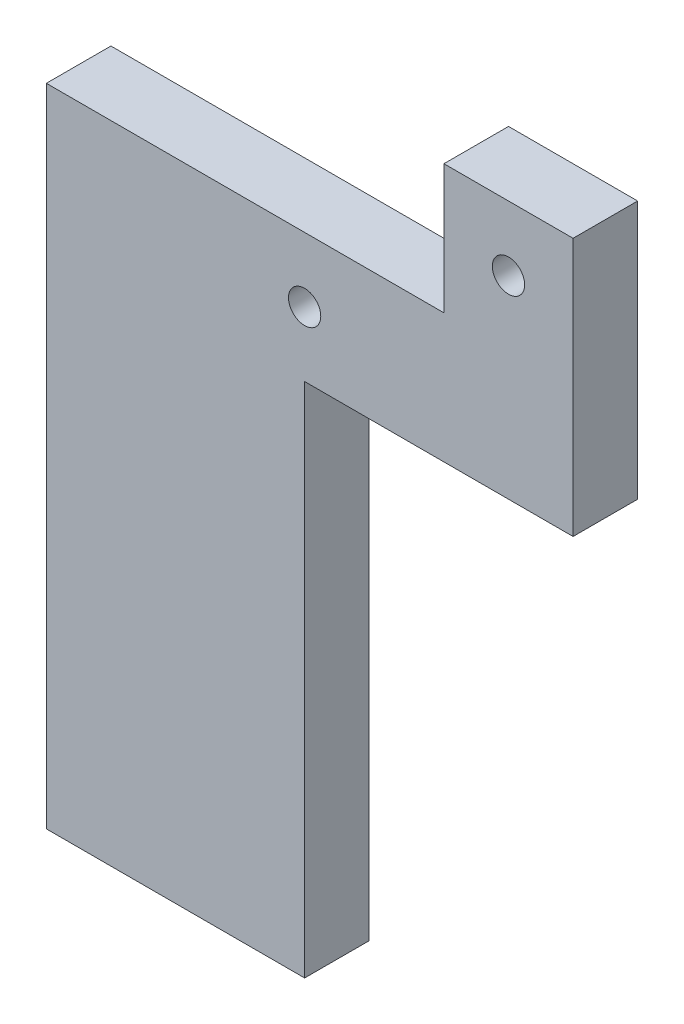
ISO-10303-21;
HEADER;
FILE_DESCRIPTION(('STEP AP214'),'2;1');
FILE_NAME('part.step','',(''),(''),'','','');
FILE_SCHEMA(('AUTOMOTIVE_DESIGN { 1 0 10303 214 1 1 1 1 }'));
ENDSEC;
DATA;
#1=APPLICATION_CONTEXT('core data for automotive mechanical design processes');
#2=APPLICATION_PROTOCOL_DEFINITION('international standard','automotive_design',2000,#1);
#3=PRODUCT_CONTEXT('',#1,'mechanical');
#4=PRODUCT('Part','Part','',(#3));
#5=PRODUCT_RELATED_PRODUCT_CATEGORY('part','',(#4));
#6=PRODUCT_DEFINITION_FORMATION('','',#4);
#7=PRODUCT_DEFINITION_CONTEXT('part definition',#1,'design');
#8=PRODUCT_DEFINITION('design','',#6,#7);
#9=PRODUCT_DEFINITION_SHAPE('','',#8);
#10=(LENGTH_UNIT() NAMED_UNIT(*) SI_UNIT(.MILLI.,.METRE.));
#11=(NAMED_UNIT(*) PLANE_ANGLE_UNIT() SI_UNIT($,.RADIAN.));
#12=(NAMED_UNIT(*) SI_UNIT($,.STERADIAN.) SOLID_ANGLE_UNIT());
#13=UNCERTAINTY_MEASURE_WITH_UNIT(LENGTH_MEASURE(1.E-05),#10,'distance_accuracy_value','');
#14=(GEOMETRIC_REPRESENTATION_CONTEXT(3) GLOBAL_UNCERTAINTY_ASSIGNED_CONTEXT((#13)) GLOBAL_UNIT_ASSIGNED_CONTEXT((#10,
#11,#12)) REPRESENTATION_CONTEXT('',''));
#15=CARTESIAN_POINT('',(0.,0.,0.));
#16=DIRECTION('',(0.,0.,1.));
#17=DIRECTION('',(1.,0.,0.));
#18=AXIS2_PLACEMENT_3D('',#15,#16,#17);
#19=CARTESIAN_POINT('',(0.,0.,6.35));
#20=DIRECTION('',(0.,0.,-1.));
#21=DIRECTION('',(-1.,0.,0.));
#22=AXIS2_PLACEMENT_3D('',#19,#20,#21);
#23=PLANE('',#22);
#24=CARTESIAN_POINT('',(25.4,57.15,6.35));
#25=DIRECTION('',(0.,0.,1.));
#26=DIRECTION('',(1.,0.,0.));
#27=AXIS2_PLACEMENT_3D('',#24,#25,#26);
#28=CIRCLE('',#27,1.5875);
#29=CARTESIAN_POINT('',(26.9875,57.15,6.35));
#30=VERTEX_POINT('',#29);
#31=EDGE_CURVE('E134',#30,#30,#28,.T.);
#32=ORIENTED_EDGE('',*,*,#31,.F.);
#33=EDGE_LOOP('',(#32));
#34=FACE_BOUND('',#33,.T.);
#35=DIRECTION('',(1.,0.,0.));
#36=VECTOR('',#35,1.);
#37=CARTESIAN_POINT('',(25.4,0.,6.35));
#38=LINE('',#37,#36);
#39=CARTESIAN_POINT('',(0.,0.,6.35));
#40=VERTEX_POINT('',#39);
#41=CARTESIAN_POINT('',(25.4,0.,6.35));
#42=VERTEX_POINT('',#41);
#43=EDGE_CURVE('E145',#40,#42,#38,.T.);
#44=ORIENTED_EDGE('',*,*,#43,.T.);
#45=DIRECTION('',(0.,1.,0.));
#46=VECTOR('',#45,1.);
#47=CARTESIAN_POINT('',(25.4,50.8,6.35));
#48=LINE('',#47,#46);
#49=CARTESIAN_POINT('',(25.4,50.8,6.35));
#50=VERTEX_POINT('',#49);
#51=EDGE_CURVE('E93',#42,#50,#48,.T.);
#52=ORIENTED_EDGE('',*,*,#51,.T.);
#53=DIRECTION('',(1.,0.,0.));
#54=VECTOR('',#53,1.);
#55=CARTESIAN_POINT('',(25.4,50.8,6.35));
#56=LINE('',#55,#54);
#57=CARTESIAN_POINT('',(51.8,50.8,6.35));
#58=VERTEX_POINT('',#57);
#59=EDGE_CURVE('E160',#50,#58,#56,.T.);
#60=ORIENTED_EDGE('',*,*,#59,.T.);
#61=DIRECTION('',(0.,1.,0.));
#62=VECTOR('',#61,1.);
#63=CARTESIAN_POINT('',(51.8,50.8,6.35));
#64=LINE('',#63,#62);
#65=CARTESIAN_POINT('',(51.8,76.2,6.35));
#66=VERTEX_POINT('',#65);
#67=EDGE_CURVE('E173',#58,#66,#64,.T.);
#68=ORIENTED_EDGE('',*,*,#67,.T.);
#69=DIRECTION('',(-1.,0.,0.));
#70=VECTOR('',#69,1.);
#71=CARTESIAN_POINT('',(51.8,76.2,6.35));
#72=LINE('',#71,#70);
#73=CARTESIAN_POINT('',(39.1,76.2,6.35));
#74=VERTEX_POINT('',#73);
#75=EDGE_CURVE('E112',#66,#74,#72,.T.);
#76=ORIENTED_EDGE('',*,*,#75,.T.);
#77=DIRECTION('',(0.,-1.,0.));
#78=VECTOR('',#77,1.);
#79=CARTESIAN_POINT('',(39.1,76.2,6.35));
#80=LINE('',#79,#78);
#81=CARTESIAN_POINT('',(39.1,63.5,6.35));
#82=VERTEX_POINT('',#81);
#83=EDGE_CURVE('E106',#74,#82,#80,.T.);
#84=ORIENTED_EDGE('',*,*,#83,.T.);
#85=DIRECTION('',(-1.,0.,0.));
#86=VECTOR('',#85,1.);
#87=CARTESIAN_POINT('',(0.,63.5,6.35));
#88=LINE('',#87,#86);
#89=CARTESIAN_POINT('',(0.,63.5,6.35));
#90=VERTEX_POINT('',#89);
#91=EDGE_CURVE('E110',#82,#90,#88,.T.);
#92=ORIENTED_EDGE('',*,*,#91,.T.);
#93=DIRECTION('',(0.,-1.,0.));
#94=VECTOR('',#93,1.);
#95=CARTESIAN_POINT('',(0.,0.,6.35));
#96=LINE('',#95,#94);
#97=EDGE_CURVE('E50',#90,#40,#96,.T.);
#98=ORIENTED_EDGE('',*,*,#97,.T.);
#99=EDGE_LOOP('',(#44,#52,#60,#68,#76,#84,#92,#98));
#100=FACE_BOUND('',#99,.T.);
#101=CARTESIAN_POINT('',(45.45,69.85,6.35));
#102=DIRECTION('',(0.,0.,1.));
#103=DIRECTION('',(1.,0.,0.));
#104=AXIS2_PLACEMENT_3D('',#101,#102,#103);
#105=CIRCLE('',#104,1.5875);
#106=CARTESIAN_POINT('',(47.0375,69.85,6.35));
#107=VERTEX_POINT('',#106);
#108=EDGE_CURVE('E182',#107,#107,#105,.T.);
#109=ORIENTED_EDGE('',*,*,#108,.F.);
#110=EDGE_LOOP('',(#109));
#111=FACE_BOUND('',#110,.T.);
#112=ADVANCED_FACE('F33',(#34,#100,#111),#23,.F.);
#113=CARTESIAN_POINT('',(0.,0.,0.));
#114=DIRECTION('',(0.,0.,-1.));
#115=DIRECTION('',(-1.,0.,0.));
#116=AXIS2_PLACEMENT_3D('',#113,#114,#115);
#117=PLANE('',#116);
#118=CARTESIAN_POINT('',(25.4,57.15,0.));
#119=DIRECTION('',(0.,0.,1.));
#120=DIRECTION('',(1.,0.,0.));
#121=AXIS2_PLACEMENT_3D('',#118,#119,#120);
#122=CIRCLE('',#121,1.5875);
#123=CARTESIAN_POINT('',(26.9875,57.15,0.));
#124=VERTEX_POINT('',#123);
#125=EDGE_CURVE('E179',#124,#124,#122,.T.);
#126=ORIENTED_EDGE('',*,*,#125,.T.);
#127=EDGE_LOOP('',(#126));
#128=FACE_BOUND('',#127,.T.);
#129=DIRECTION('',(1.,0.,0.));
#130=VECTOR('',#129,1.);
#131=CARTESIAN_POINT('',(25.4,0.,0.));
#132=LINE('',#131,#130);
#133=CARTESIAN_POINT('',(0.,0.,0.));
#134=VERTEX_POINT('',#133);
#135=CARTESIAN_POINT('',(25.4,0.,0.));
#136=VERTEX_POINT('',#135);
#137=EDGE_CURVE('E130',#134,#136,#132,.T.);
#138=ORIENTED_EDGE('',*,*,#137,.F.);
#139=DIRECTION('',(0.,-1.,0.));
#140=VECTOR('',#139,1.);
#141=CARTESIAN_POINT('',(0.,0.,0.));
#142=LINE('',#141,#140);
#143=CARTESIAN_POINT('',(0.,63.5,0.));
#144=VERTEX_POINT('',#143);
#145=EDGE_CURVE('E85',#144,#134,#142,.T.);
#146=ORIENTED_EDGE('',*,*,#145,.F.);
#147=DIRECTION('',(-1.,0.,0.));
#148=VECTOR('',#147,1.);
#149=CARTESIAN_POINT('',(0.,63.5,0.));
#150=LINE('',#149,#148);
#151=CARTESIAN_POINT('',(39.1,63.5,0.));
#152=VERTEX_POINT('',#151);
#153=EDGE_CURVE('E79',#152,#144,#150,.T.);
#154=ORIENTED_EDGE('',*,*,#153,.F.);
#155=DIRECTION('',(0.,-1.,0.));
#156=VECTOR('',#155,1.);
#157=CARTESIAN_POINT('',(39.1,76.2,0.));
#158=LINE('',#157,#156);
#159=CARTESIAN_POINT('',(39.1,76.2,0.));
#160=VERTEX_POINT('',#159);
#161=EDGE_CURVE('E120',#160,#152,#158,.T.);
#162=ORIENTED_EDGE('',*,*,#161,.F.);
#163=DIRECTION('',(-1.,0.,0.));
#164=VECTOR('',#163,1.);
#165=CARTESIAN_POINT('',(51.8,76.2,0.));
#166=LINE('',#165,#164);
#167=CARTESIAN_POINT('',(51.8,76.2,0.));
#168=VERTEX_POINT('',#167);
#169=EDGE_CURVE('E140',#168,#160,#166,.T.);
#170=ORIENTED_EDGE('',*,*,#169,.F.);
#171=DIRECTION('',(0.,1.,0.));
#172=VECTOR('',#171,1.);
#173=CARTESIAN_POINT('',(51.8,50.8,0.));
#174=LINE('',#173,#172);
#175=CARTESIAN_POINT('',(51.8,50.8,0.));
#176=VERTEX_POINT('',#175);
#177=EDGE_CURVE('E138',#176,#168,#174,.T.);
#178=ORIENTED_EDGE('',*,*,#177,.F.);
#179=DIRECTION('',(1.,0.,0.));
#180=VECTOR('',#179,1.);
#181=CARTESIAN_POINT('',(25.4,50.8,0.));
#182=LINE('',#181,#180);
#183=CARTESIAN_POINT('',(25.4,50.8,0.));
#184=VERTEX_POINT('',#183);
#185=EDGE_CURVE('E136',#184,#176,#182,.T.);
#186=ORIENTED_EDGE('',*,*,#185,.F.);
#187=DIRECTION('',(0.,1.,0.));
#188=VECTOR('',#187,1.);
#189=CARTESIAN_POINT('',(25.4,50.8,0.));
#190=LINE('',#189,#188);
#191=EDGE_CURVE('E133',#136,#184,#190,.T.);
#192=ORIENTED_EDGE('',*,*,#191,.F.);
#193=EDGE_LOOP('',(#138,#146,#154,#162,#170,#178,#186,#192));
#194=FACE_BOUND('',#193,.T.);
#195=CARTESIAN_POINT('',(45.45,69.85,0.));
#196=DIRECTION('',(0.,0.,1.));
#197=DIRECTION('',(1.,0.,0.));
#198=AXIS2_PLACEMENT_3D('',#195,#196,#197);
#199=CIRCLE('',#198,1.5875);
#200=CARTESIAN_POINT('',(47.0375,69.85,0.));
#201=VERTEX_POINT('',#200);
#202=EDGE_CURVE('E185',#201,#201,#199,.T.);
#203=ORIENTED_EDGE('',*,*,#202,.T.);
#204=EDGE_LOOP('',(#203));
#205=FACE_BOUND('',#204,.T.);
#206=ADVANCED_FACE('F164',(#128,#194,#205),#117,.T.);
#207=CARTESIAN_POINT('',(25.4,0.,6.35));
#208=DIRECTION('',(0.,1.,0.));
#209=DIRECTION('',(-1.,0.,0.));
#210=AXIS2_PLACEMENT_3D('',#207,#208,#209);
#211=PLANE('',#210);
#212=ORIENTED_EDGE('',*,*,#137,.T.);
#213=DIRECTION('',(0.,0.,-1.));
#214=VECTOR('',#213,1.);
#215=CARTESIAN_POINT('',(25.4,0.,6.35));
#216=LINE('',#215,#214);
#217=EDGE_CURVE('E11',#42,#136,#216,.T.);
#218=ORIENTED_EDGE('',*,*,#217,.F.);
#219=ORIENTED_EDGE('',*,*,#43,.F.);
#220=DIRECTION('',(0.,0.,-1.));
#221=VECTOR('',#220,1.);
#222=CARTESIAN_POINT('',(0.,0.,6.35));
#223=LINE('',#222,#221);
#224=EDGE_CURVE('E126',#40,#134,#223,.T.);
#225=ORIENTED_EDGE('',*,*,#224,.T.);
#226=EDGE_LOOP('',(#212,#218,#219,#225));
#227=FACE_BOUND('',#226,.T.);
#228=ADVANCED_FACE('F35',(#227),#211,.F.);
#229=CARTESIAN_POINT('',(25.4,50.8,6.35));
#230=DIRECTION('',(-1.,0.,0.));
#231=DIRECTION('',(0.,-1.,0.));
#232=AXIS2_PLACEMENT_3D('',#229,#230,#231);
#233=PLANE('',#232);
#234=ORIENTED_EDGE('',*,*,#191,.T.);
#235=DIRECTION('',(0.,0.,-1.));
#236=VECTOR('',#235,1.);
#237=CARTESIAN_POINT('',(25.4,50.8,6.35));
#238=LINE('',#237,#236);
#239=EDGE_CURVE('E42',#50,#184,#238,.T.);
#240=ORIENTED_EDGE('',*,*,#239,.F.);
#241=ORIENTED_EDGE('',*,*,#51,.F.);
#242=ORIENTED_EDGE('',*,*,#217,.T.);
#243=EDGE_LOOP('',(#234,#240,#241,#242));
#244=FACE_BOUND('',#243,.T.);
#245=ADVANCED_FACE('F218',(#244),#233,.F.);
#246=CARTESIAN_POINT('',(25.4,50.8,6.35));
#247=DIRECTION('',(0.,1.,0.));
#248=DIRECTION('',(-1.,0.,0.));
#249=AXIS2_PLACEMENT_3D('',#246,#247,#248);
#250=PLANE('',#249);
#251=ORIENTED_EDGE('',*,*,#185,.T.);
#252=DIRECTION('',(0.,0.,-1.));
#253=VECTOR('',#252,1.);
#254=CARTESIAN_POINT('',(51.8,50.8,6.35));
#255=LINE('',#254,#253);
#256=EDGE_CURVE('E152',#58,#176,#255,.T.);
#257=ORIENTED_EDGE('',*,*,#256,.F.);
#258=ORIENTED_EDGE('',*,*,#59,.F.);
#259=ORIENTED_EDGE('',*,*,#239,.T.);
#260=EDGE_LOOP('',(#251,#257,#258,#259));
#261=FACE_BOUND('',#260,.T.);
#262=ADVANCED_FACE('F158',(#261),#250,.F.);
#263=CARTESIAN_POINT('',(51.8,50.8,6.35));
#264=DIRECTION('',(-1.,0.,0.));
#265=DIRECTION('',(0.,0.,1.));
#266=AXIS2_PLACEMENT_3D('',#263,#264,#265);
#267=PLANE('',#266);
#268=ORIENTED_EDGE('',*,*,#177,.T.);
#269=DIRECTION('',(0.,0.,-1.));
#270=VECTOR('',#269,1.);
#271=CARTESIAN_POINT('',(51.8,76.2,6.35));
#272=LINE('',#271,#270);
#273=EDGE_CURVE('E149',#66,#168,#272,.T.);
#274=ORIENTED_EDGE('',*,*,#273,.F.);
#275=ORIENTED_EDGE('',*,*,#67,.F.);
#276=ORIENTED_EDGE('',*,*,#256,.T.);
#277=EDGE_LOOP('',(#268,#274,#275,#276));
#278=FACE_BOUND('',#277,.T.);
#279=ADVANCED_FACE('F169',(#278),#267,.F.);
#280=CARTESIAN_POINT('',(51.8,76.2,6.35));
#281=DIRECTION('',(0.,-1.,0.));
#282=DIRECTION('',(0.,0.,-1.));
#283=AXIS2_PLACEMENT_3D('',#280,#281,#282);
#284=PLANE('',#283);
#285=ORIENTED_EDGE('',*,*,#169,.T.);
#286=DIRECTION('',(0.,0.,-1.));
#287=VECTOR('',#286,1.);
#288=CARTESIAN_POINT('',(39.1,76.2,6.35));
#289=LINE('',#288,#287);
#290=EDGE_CURVE('E121',#74,#160,#289,.T.);
#291=ORIENTED_EDGE('',*,*,#290,.F.);
#292=ORIENTED_EDGE('',*,*,#75,.F.);
#293=ORIENTED_EDGE('',*,*,#273,.T.);
#294=EDGE_LOOP('',(#285,#291,#292,#293));
#295=FACE_BOUND('',#294,.T.);
#296=ADVANCED_FACE('F172',(#295),#284,.F.);
#297=CARTESIAN_POINT('',(39.1,76.2,6.35));
#298=DIRECTION('',(1.,0.,0.));
#299=DIRECTION('',(0.,0.,-1.));
#300=AXIS2_PLACEMENT_3D('',#297,#298,#299);
#301=PLANE('',#300);
#302=ORIENTED_EDGE('',*,*,#161,.T.);
#303=DIRECTION('',(0.,0.,-1.));
#304=VECTOR('',#303,1.);
#305=CARTESIAN_POINT('',(39.1,63.5,6.35));
#306=LINE('',#305,#304);
#307=EDGE_CURVE('E117',#82,#152,#306,.T.);
#308=ORIENTED_EDGE('',*,*,#307,.F.);
#309=ORIENTED_EDGE('',*,*,#83,.F.);
#310=ORIENTED_EDGE('',*,*,#290,.T.);
#311=EDGE_LOOP('',(#302,#308,#309,#310));
#312=FACE_BOUND('',#311,.T.);
#313=ADVANCED_FACE('F118',(#312),#301,.F.);
#314=CARTESIAN_POINT('',(0.,63.5,6.35));
#315=DIRECTION('',(0.,-1.,0.));
#316=DIRECTION('',(0.,0.,-1.));
#317=AXIS2_PLACEMENT_3D('',#314,#315,#316);
#318=PLANE('',#317);
#319=ORIENTED_EDGE('',*,*,#153,.T.);
#320=DIRECTION('',(0.,0.,-1.));
#321=VECTOR('',#320,1.);
#322=CARTESIAN_POINT('',(0.,63.5,6.35));
#323=LINE('',#322,#321);
#324=EDGE_CURVE('E122',#90,#144,#323,.T.);
#325=ORIENTED_EDGE('',*,*,#324,.F.);
#326=ORIENTED_EDGE('',*,*,#91,.F.);
#327=ORIENTED_EDGE('',*,*,#307,.T.);
#328=EDGE_LOOP('',(#319,#325,#326,#327));
#329=FACE_BOUND('',#328,.T.);
#330=ADVANCED_FACE('F124',(#329),#318,.F.);
#331=CARTESIAN_POINT('',(0.,0.,6.35));
#332=DIRECTION('',(1.,0.,0.));
#333=DIRECTION('',(0.,0.,-1.));
#334=AXIS2_PLACEMENT_3D('',#331,#332,#333);
#335=PLANE('',#334);
#336=ORIENTED_EDGE('',*,*,#145,.T.);
#337=ORIENTED_EDGE('',*,*,#224,.F.);
#338=ORIENTED_EDGE('',*,*,#97,.F.);
#339=ORIENTED_EDGE('',*,*,#324,.T.);
#340=EDGE_LOOP('',(#336,#337,#338,#339));
#341=FACE_BOUND('',#340,.T.);
#342=ADVANCED_FACE('F206',(#341),#335,.F.);
#343=CARTESIAN_POINT('',(25.4,57.15,6.35));
#344=DIRECTION('',(0.,0.,-1.));
#345=DIRECTION('',(-1.,0.,0.));
#346=AXIS2_PLACEMENT_3D('',#343,#344,#345);
#347=CYLINDRICAL_SURFACE('',#346,1.5875);
#348=ORIENTED_EDGE('',*,*,#31,.T.);
#349=EDGE_LOOP('',(#348));
#350=FACE_BOUND('',#349,.T.);
#351=ORIENTED_EDGE('',*,*,#125,.F.);
#352=EDGE_LOOP('',(#351));
#353=FACE_BOUND('',#352,.T.);
#354=ADVANCED_FACE('F203',(#350,#353),#347,.F.);
#355=CARTESIAN_POINT('',(45.45,69.85,6.35));
#356=DIRECTION('',(0.,0.,-1.));
#357=DIRECTION('',(-1.,0.,0.));
#358=AXIS2_PLACEMENT_3D('',#355,#356,#357);
#359=CYLINDRICAL_SURFACE('',#358,1.5875);
#360=ORIENTED_EDGE('',*,*,#108,.T.);
#361=EDGE_LOOP('',(#360));
#362=FACE_BOUND('',#361,.T.);
#363=ORIENTED_EDGE('',*,*,#202,.F.);
#364=EDGE_LOOP('',(#363));
#365=FACE_BOUND('',#364,.T.);
#366=ADVANCED_FACE('F191',(#362,#365),#359,.F.);
#367=CLOSED_SHELL('',(#112,#206,#228,#245,#262,#279,#296,#313,#330,#342,#354,#366));
#368=MANIFOLD_SOLID_BREP('B2',#367);
#369=ADVANCED_BREP_SHAPE_REPRESENTATION('',(#18,#368),#14);
#370=SHAPE_DEFINITION_REPRESENTATION(#9,#369);
ENDSEC;
END-ISO-10303-21;
